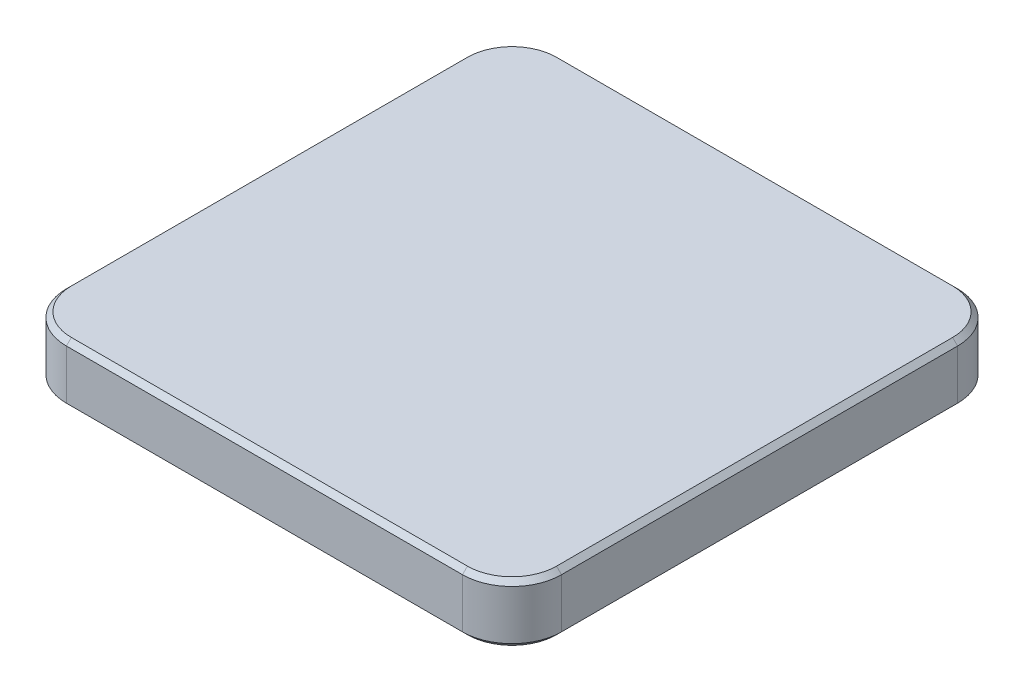
ISO-10303-21;
HEADER;
FILE_DESCRIPTION(('STEP AP214'),'2;1');
FILE_NAME('part.step','',(''),(''),'','','');
FILE_SCHEMA(('AUTOMOTIVE_DESIGN { 1 0 10303 214 1 1 1 1 }'));
ENDSEC;
DATA;
#1=APPLICATION_CONTEXT('core data for automotive mechanical design processes');
#2=APPLICATION_PROTOCOL_DEFINITION('international standard','automotive_design',2000,#1);
#3=PRODUCT_CONTEXT('',#1,'mechanical');
#4=PRODUCT('Part','Part','',(#3));
#5=PRODUCT_RELATED_PRODUCT_CATEGORY('part','',(#4));
#6=PRODUCT_DEFINITION_FORMATION('','',#4);
#7=PRODUCT_DEFINITION_CONTEXT('part definition',#1,'design');
#8=PRODUCT_DEFINITION('design','',#6,#7);
#9=PRODUCT_DEFINITION_SHAPE('','',#8);
#10=(LENGTH_UNIT() NAMED_UNIT(*) SI_UNIT(.MILLI.,.METRE.));
#11=(NAMED_UNIT(*) PLANE_ANGLE_UNIT() SI_UNIT($,.RADIAN.));
#12=(NAMED_UNIT(*) SI_UNIT($,.STERADIAN.) SOLID_ANGLE_UNIT());
#13=UNCERTAINTY_MEASURE_WITH_UNIT(LENGTH_MEASURE(1.E-05),#10,'distance_accuracy_value','');
#14=(GEOMETRIC_REPRESENTATION_CONTEXT(3) GLOBAL_UNCERTAINTY_ASSIGNED_CONTEXT((#13)) GLOBAL_UNIT_ASSIGNED_CONTEXT((#10,
#11,#12)) REPRESENTATION_CONTEXT('',''));
#15=CARTESIAN_POINT('',(0.,0.,0.));
#16=DIRECTION('',(0.,0.,1.));
#17=DIRECTION('',(1.,0.,0.));
#18=AXIS2_PLACEMENT_3D('',#15,#16,#17);
#19=CARTESIAN_POINT('',(50.,12.,50.));
#20=DIRECTION('',(-1.,0.,0.));
#21=DIRECTION('',(0.,0.,1.));
#22=AXIS2_PLACEMENT_3D('',#19,#20,#21);
#23=PLANE('',#22);
#24=DIRECTION('',(0.,-1.,0.));
#25=VECTOR('',#24,1.);
#26=CARTESIAN_POINT('',(50.,12.,40.));
#27=LINE('',#26,#25);
#28=CARTESIAN_POINT('',(50.,11.,40.));
#29=VERTEX_POINT('',#28);
#30=CARTESIAN_POINT('',(50.,1.,40.));
#31=VERTEX_POINT('',#30);
#32=EDGE_CURVE('E338',#29,#31,#27,.T.);
#33=ORIENTED_EDGE('',*,*,#32,.T.);
#34=DIRECTION('',(0.,0.,-1.));
#35=VECTOR('',#34,1.);
#36=CARTESIAN_POINT('',(50.,1.,-40.));
#37=LINE('',#36,#35);
#38=CARTESIAN_POINT('',(50.,1.,-40.));
#39=VERTEX_POINT('',#38);
#40=EDGE_CURVE('E11',#31,#39,#37,.T.);
#41=ORIENTED_EDGE('',*,*,#40,.T.);
#42=DIRECTION('',(0.,-1.,0.));
#43=VECTOR('',#42,1.);
#44=CARTESIAN_POINT('',(50.,12.,-40.));
#45=LINE('',#44,#43);
#46=CARTESIAN_POINT('',(50.,11.,-40.));
#47=VERTEX_POINT('',#46);
#48=EDGE_CURVE('E295',#39,#47,#45,.F.);
#49=ORIENTED_EDGE('',*,*,#48,.T.);
#50=DIRECTION('',(0.,0.,1.));
#51=VECTOR('',#50,1.);
#52=CARTESIAN_POINT('',(50.,11.,50.));
#53=LINE('',#52,#51);
#54=EDGE_CURVE('E272',#47,#29,#53,.T.);
#55=ORIENTED_EDGE('',*,*,#54,.T.);
#56=EDGE_LOOP('',(#33,#41,#49,#55));
#57=FACE_BOUND('',#56,.T.);
#58=ADVANCED_FACE('F38',(#57),#23,.F.);
#59=CARTESIAN_POINT('',(-50.,12.,-50.));
#60=DIRECTION('',(0.,0.,1.));
#61=DIRECTION('',(1.,0.,0.));
#62=AXIS2_PLACEMENT_3D('',#59,#60,#61);
#63=PLANE('',#62);
#64=DIRECTION('',(0.,-1.,0.));
#65=VECTOR('',#64,1.);
#66=CARTESIAN_POINT('',(40.,12.,-50.));
#67=LINE('',#66,#65);
#68=CARTESIAN_POINT('',(40.,11.,-50.));
#69=VERTEX_POINT('',#68);
#70=CARTESIAN_POINT('',(40.,1.,-50.));
#71=VERTEX_POINT('',#70);
#72=EDGE_CURVE('E334',#69,#71,#67,.T.);
#73=ORIENTED_EDGE('',*,*,#72,.T.);
#74=DIRECTION('',(-1.,0.,0.));
#75=VECTOR('',#74,1.);
#76=CARTESIAN_POINT('',(-40.,1.,-50.));
#77=LINE('',#76,#75);
#78=CARTESIAN_POINT('',(-40.,1.,-50.));
#79=VERTEX_POINT('',#78);
#80=EDGE_CURVE('E217',#71,#79,#77,.T.);
#81=ORIENTED_EDGE('',*,*,#80,.T.);
#82=DIRECTION('',(0.,-1.,0.));
#83=VECTOR('',#82,1.);
#84=CARTESIAN_POINT('',(-40.,12.,-50.));
#85=LINE('',#84,#83);
#86=CARTESIAN_POINT('',(-40.,11.,-50.));
#87=VERTEX_POINT('',#86);
#88=EDGE_CURVE('E315',#79,#87,#85,.F.);
#89=ORIENTED_EDGE('',*,*,#88,.T.);
#90=DIRECTION('',(1.,0.,0.));
#91=VECTOR('',#90,1.);
#92=CARTESIAN_POINT('',(-50.,11.,-50.));
#93=LINE('',#92,#91);
#94=EDGE_CURVE('E309',#87,#69,#93,.T.);
#95=ORIENTED_EDGE('',*,*,#94,.T.);
#96=EDGE_LOOP('',(#73,#81,#89,#95));
#97=FACE_BOUND('',#96,.T.);
#98=ADVANCED_FACE('F353',(#97),#63,.F.);
#99=CARTESIAN_POINT('',(-50.,12.,50.));
#100=DIRECTION('',(1.,0.,0.));
#101=DIRECTION('',(0.,0.,-1.));
#102=AXIS2_PLACEMENT_3D('',#99,#100,#101);
#103=PLANE('',#102);
#104=DIRECTION('',(0.,-1.,0.));
#105=VECTOR('',#104,1.);
#106=CARTESIAN_POINT('',(-50.,12.,-40.));
#107=LINE('',#106,#105);
#108=CARTESIAN_POINT('',(-50.,11.,-40.));
#109=VERTEX_POINT('',#108);
#110=CARTESIAN_POINT('',(-50.,1.,-40.));
#111=VERTEX_POINT('',#110);
#112=EDGE_CURVE('E317',#109,#111,#107,.T.);
#113=ORIENTED_EDGE('',*,*,#112,.T.);
#114=DIRECTION('',(0.,0.,1.));
#115=VECTOR('',#114,1.);
#116=CARTESIAN_POINT('',(-50.,1.,40.));
#117=LINE('',#116,#115);
#118=CARTESIAN_POINT('',(-50.,1.,40.));
#119=VERTEX_POINT('',#118);
#120=EDGE_CURVE('E190',#111,#119,#117,.T.);
#121=ORIENTED_EDGE('',*,*,#120,.T.);
#122=DIRECTION('',(0.,-1.,0.));
#123=VECTOR('',#122,1.);
#124=CARTESIAN_POINT('',(-50.,12.,40.));
#125=LINE('',#124,#123);
#126=CARTESIAN_POINT('',(-50.,11.,40.));
#127=VERTEX_POINT('',#126);
#128=EDGE_CURVE('E183',#119,#127,#125,.F.);
#129=ORIENTED_EDGE('',*,*,#128,.T.);
#130=DIRECTION('',(0.,0.,-1.));
#131=VECTOR('',#130,1.);
#132=CARTESIAN_POINT('',(-50.,11.,50.));
#133=LINE('',#132,#131);
#134=EDGE_CURVE('E267',#127,#109,#133,.T.);
#135=ORIENTED_EDGE('',*,*,#134,.T.);
#136=EDGE_LOOP('',(#113,#121,#129,#135));
#137=FACE_BOUND('',#136,.T.);
#138=ADVANCED_FACE('F358',(#137),#103,.F.);
#139=CARTESIAN_POINT('',(-50.,12.,50.));
#140=DIRECTION('',(0.,0.,-1.));
#141=DIRECTION('',(-1.,0.,0.));
#142=AXIS2_PLACEMENT_3D('',#139,#140,#141);
#143=PLANE('',#142);
#144=DIRECTION('',(0.,-1.,0.));
#145=VECTOR('',#144,1.);
#146=CARTESIAN_POINT('',(-40.,12.,50.));
#147=LINE('',#146,#145);
#148=CARTESIAN_POINT('',(-40.,11.,50.));
#149=VERTEX_POINT('',#148);
#150=CARTESIAN_POINT('',(-40.,1.,50.));
#151=VERTEX_POINT('',#150);
#152=EDGE_CURVE('E176',#149,#151,#147,.T.);
#153=ORIENTED_EDGE('',*,*,#152,.T.);
#154=DIRECTION('',(1.,0.,0.));
#155=VECTOR('',#154,1.);
#156=CARTESIAN_POINT('',(40.,1.,50.));
#157=LINE('',#156,#155);
#158=CARTESIAN_POINT('',(40.,1.,50.));
#159=VERTEX_POINT('',#158);
#160=EDGE_CURVE('E215',#151,#159,#157,.T.);
#161=ORIENTED_EDGE('',*,*,#160,.T.);
#162=DIRECTION('',(0.,-1.,0.));
#163=VECTOR('',#162,1.);
#164=CARTESIAN_POINT('',(40.,12.,50.));
#165=LINE('',#164,#163);
#166=CARTESIAN_POINT('',(40.,11.,50.));
#167=VERTEX_POINT('',#166);
#168=EDGE_CURVE('E289',#159,#167,#165,.F.);
#169=ORIENTED_EDGE('',*,*,#168,.T.);
#170=DIRECTION('',(-1.,0.,0.));
#171=VECTOR('',#170,1.);
#172=CARTESIAN_POINT('',(-50.,11.,50.));
#173=LINE('',#172,#171);
#174=EDGE_CURVE('E194',#167,#149,#173,.T.);
#175=ORIENTED_EDGE('',*,*,#174,.T.);
#176=EDGE_LOOP('',(#153,#161,#169,#175));
#177=FACE_BOUND('',#176,.T.);
#178=ADVANCED_FACE('F287',(#177),#143,.F.);
#179=CARTESIAN_POINT('',(0.,12.,0.));
#180=DIRECTION('',(0.,-1.,0.));
#181=DIRECTION('',(0.,0.,-1.));
#182=AXIS2_PLACEMENT_3D('',#179,#180,#181);
#183=PLANE('',#182);
#184=CARTESIAN_POINT('',(40.,12.,-40.));
#185=DIRECTION('',(0.,-1.,0.));
#186=DIRECTION('',(0.,0.,-1.));
#187=AXIS2_PLACEMENT_3D('',#184,#185,#186);
#188=CIRCLE('',#187,8.99999999999998);
#189=CARTESIAN_POINT('',(49.,12.,-40.));
#190=VERTEX_POINT('',#189);
#191=CARTESIAN_POINT('',(40.,12.,-49.));
#192=VERTEX_POINT('',#191);
#193=EDGE_CURVE('E302',#190,#192,#188,.F.);
#194=ORIENTED_EDGE('',*,*,#193,.T.);
#195=DIRECTION('',(-1.,0.,0.));
#196=VECTOR('',#195,1.);
#197=CARTESIAN_POINT('',(0.,12.,-49.));
#198=LINE('',#197,#196);
#199=CARTESIAN_POINT('',(-40.,12.,-49.));
#200=VERTEX_POINT('',#199);
#201=EDGE_CURVE('E306',#192,#200,#198,.T.);
#202=ORIENTED_EDGE('',*,*,#201,.T.);
#203=CARTESIAN_POINT('',(-40.,12.,-40.));
#204=DIRECTION('',(0.,-1.,0.));
#205=DIRECTION('',(0.,0.,-1.));
#206=AXIS2_PLACEMENT_3D('',#203,#204,#205);
#207=CIRCLE('',#206,8.99999999999998);
#208=CARTESIAN_POINT('',(-49.,12.,-40.));
#209=VERTEX_POINT('',#208);
#210=EDGE_CURVE('E304',#200,#209,#207,.F.);
#211=ORIENTED_EDGE('',*,*,#210,.T.);
#212=DIRECTION('',(0.,0.,1.));
#213=VECTOR('',#212,1.);
#214=CARTESIAN_POINT('',(-49.,12.,0.));
#215=LINE('',#214,#213);
#216=CARTESIAN_POINT('',(-49.,12.,40.));
#217=VERTEX_POINT('',#216);
#218=EDGE_CURVE('E159',#209,#217,#215,.T.);
#219=ORIENTED_EDGE('',*,*,#218,.T.);
#220=CARTESIAN_POINT('',(-40.,12.,40.));
#221=DIRECTION('',(0.,-1.,0.));
#222=DIRECTION('',(0.,0.,-1.));
#223=AXIS2_PLACEMENT_3D('',#220,#221,#222);
#224=CIRCLE('',#223,8.99999999999998);
#225=CARTESIAN_POINT('',(-40.,12.,49.));
#226=VERTEX_POINT('',#225);
#227=EDGE_CURVE('E153',#217,#226,#224,.F.);
#228=ORIENTED_EDGE('',*,*,#227,.T.);
#229=DIRECTION('',(1.,0.,0.));
#230=VECTOR('',#229,1.);
#231=CARTESIAN_POINT('',(0.,12.,49.));
#232=LINE('',#231,#230);
#233=CARTESIAN_POINT('',(40.,12.,49.));
#234=VERTEX_POINT('',#233);
#235=EDGE_CURVE('E156',#226,#234,#232,.T.);
#236=ORIENTED_EDGE('',*,*,#235,.T.);
#237=CARTESIAN_POINT('',(40.,12.,40.));
#238=DIRECTION('',(0.,-1.,0.));
#239=DIRECTION('',(0.,0.,-1.));
#240=AXIS2_PLACEMENT_3D('',#237,#238,#239);
#241=CIRCLE('',#240,8.99999999999998);
#242=CARTESIAN_POINT('',(49.,12.,40.));
#243=VERTEX_POINT('',#242);
#244=EDGE_CURVE('E165',#234,#243,#241,.F.);
#245=ORIENTED_EDGE('',*,*,#244,.T.);
#246=DIRECTION('',(0.,0.,-1.));
#247=VECTOR('',#246,1.);
#248=CARTESIAN_POINT('',(49.,12.,0.));
#249=LINE('',#248,#247);
#250=EDGE_CURVE('E164',#243,#190,#249,.T.);
#251=ORIENTED_EDGE('',*,*,#250,.T.);
#252=EDGE_LOOP('',(#194,#202,#211,#219,#228,#236,#245,#251));
#253=FACE_BOUND('',#252,.T.);
#254=ADVANCED_FACE('F155',(#253),#183,.F.);
#255=CARTESIAN_POINT('',(0.,0.,0.));
#256=DIRECTION('',(0.,-1.,0.));
#257=DIRECTION('',(0.,0.,-1.));
#258=AXIS2_PLACEMENT_3D('',#255,#256,#257);
#259=PLANE('',#258);
#260=CARTESIAN_POINT('',(-40.,0.,40.));
#261=DIRECTION('',(0.,-1.,0.));
#262=DIRECTION('',(0.,0.,-1.));
#263=AXIS2_PLACEMENT_3D('',#260,#261,#262);
#264=CIRCLE('',#263,8.99999999999999);
#265=CARTESIAN_POINT('',(-40.,0.,49.));
#266=VERTEX_POINT('',#265);
#267=CARTESIAN_POINT('',(-49.,0.,40.));
#268=VERTEX_POINT('',#267);
#269=EDGE_CURVE('E206',#266,#268,#264,.T.);
#270=ORIENTED_EDGE('',*,*,#269,.T.);
#271=DIRECTION('',(0.,0.,-1.));
#272=VECTOR('',#271,1.);
#273=CARTESIAN_POINT('',(-49.,0.,-40.));
#274=LINE('',#273,#272);
#275=CARTESIAN_POINT('',(-49.,0.,-40.));
#276=VERTEX_POINT('',#275);
#277=EDGE_CURVE('E208',#268,#276,#274,.T.);
#278=ORIENTED_EDGE('',*,*,#277,.T.);
#279=CARTESIAN_POINT('',(-40.,0.,-40.));
#280=DIRECTION('',(0.,-1.,0.));
#281=DIRECTION('',(0.,0.,-1.));
#282=AXIS2_PLACEMENT_3D('',#279,#280,#281);
#283=CIRCLE('',#282,8.99999999999999);
#284=CARTESIAN_POINT('',(-40.,0.,-49.));
#285=VERTEX_POINT('',#284);
#286=EDGE_CURVE('E204',#276,#285,#283,.T.);
#287=ORIENTED_EDGE('',*,*,#286,.T.);
#288=DIRECTION('',(1.,0.,0.));
#289=VECTOR('',#288,1.);
#290=CARTESIAN_POINT('',(40.,0.,-49.));
#291=LINE('',#290,#289);
#292=CARTESIAN_POINT('',(40.,0.,-49.));
#293=VERTEX_POINT('',#292);
#294=EDGE_CURVE('E200',#285,#293,#291,.T.);
#295=ORIENTED_EDGE('',*,*,#294,.T.);
#296=CARTESIAN_POINT('',(40.,0.,-40.));
#297=DIRECTION('',(0.,-1.,0.));
#298=DIRECTION('',(0.,0.,-1.));
#299=AXIS2_PLACEMENT_3D('',#296,#297,#298);
#300=CIRCLE('',#299,8.99999999999999);
#301=CARTESIAN_POINT('',(49.,0.,-40.));
#302=VERTEX_POINT('',#301);
#303=EDGE_CURVE('E196',#293,#302,#300,.T.);
#304=ORIENTED_EDGE('',*,*,#303,.T.);
#305=DIRECTION('',(0.,0.,1.));
#306=VECTOR('',#305,1.);
#307=CARTESIAN_POINT('',(49.,0.,40.));
#308=LINE('',#307,#306);
#309=CARTESIAN_POINT('',(49.,0.,40.));
#310=VERTEX_POINT('',#309);
#311=EDGE_CURVE('E193',#302,#310,#308,.T.);
#312=ORIENTED_EDGE('',*,*,#311,.T.);
#313=CARTESIAN_POINT('',(40.,0.,40.));
#314=DIRECTION('',(0.,-1.,0.));
#315=DIRECTION('',(0.,0.,-1.));
#316=AXIS2_PLACEMENT_3D('',#313,#314,#315);
#317=CIRCLE('',#316,8.99999999999999);
#318=CARTESIAN_POINT('',(40.,0.,49.));
#319=VERTEX_POINT('',#318);
#320=EDGE_CURVE('E198',#310,#319,#317,.T.);
#321=ORIENTED_EDGE('',*,*,#320,.T.);
#322=DIRECTION('',(-1.,0.,0.));
#323=VECTOR('',#322,1.);
#324=CARTESIAN_POINT('',(-40.,0.,49.));
#325=LINE('',#324,#323);
#326=EDGE_CURVE('E202',#319,#266,#325,.T.);
#327=ORIENTED_EDGE('',*,*,#326,.T.);
#328=EDGE_LOOP('',(#270,#278,#287,#295,#304,#312,#321,#327));
#329=FACE_BOUND('',#328,.T.);
#330=ADVANCED_FACE('F364',(#329),#259,.T.);
#331=CARTESIAN_POINT('',(-40.,12.,-40.));
#332=DIRECTION('',(0.,-1.,0.));
#333=DIRECTION('',(0.,0.,-1.));
#334=AXIS2_PLACEMENT_3D('',#331,#332,#333);
#335=CYLINDRICAL_SURFACE('',#334,10.);
#336=ORIENTED_EDGE('',*,*,#88,.F.);
#337=CARTESIAN_POINT('',(-40.,1.,-40.));
#338=DIRECTION('',(0.,-1.,0.));
#339=DIRECTION('',(0.,0.,-1.));
#340=AXIS2_PLACEMENT_3D('',#337,#338,#339);
#341=CIRCLE('',#340,10.);
#342=EDGE_CURVE('E213',#79,#111,#341,.F.);
#343=ORIENTED_EDGE('',*,*,#342,.T.);
#344=ORIENTED_EDGE('',*,*,#112,.F.);
#345=CARTESIAN_POINT('',(-40.,11.,-40.));
#346=DIRECTION('',(0.,-1.,0.));
#347=DIRECTION('',(0.,0.,-1.));
#348=AXIS2_PLACEMENT_3D('',#345,#346,#347);
#349=CIRCLE('',#348,10.);
#350=EDGE_CURVE('E277',#109,#87,#349,.T.);
#351=ORIENTED_EDGE('',*,*,#350,.T.);
#352=EDGE_LOOP('',(#336,#343,#344,#351));
#353=FACE_BOUND('',#352,.T.);
#354=ADVANCED_FACE('F314',(#353),#335,.T.);
#355=CARTESIAN_POINT('',(40.,12.,-40.));
#356=DIRECTION('',(0.,-1.,0.));
#357=DIRECTION('',(0.,0.,-1.));
#358=AXIS2_PLACEMENT_3D('',#355,#356,#357);
#359=CYLINDRICAL_SURFACE('',#358,10.);
#360=ORIENTED_EDGE('',*,*,#48,.F.);
#361=CARTESIAN_POINT('',(40.,1.,-40.));
#362=DIRECTION('',(0.,-1.,0.));
#363=DIRECTION('',(0.,0.,-1.));
#364=AXIS2_PLACEMENT_3D('',#361,#362,#363);
#365=CIRCLE('',#364,10.);
#366=EDGE_CURVE('E48',#39,#71,#365,.F.);
#367=ORIENTED_EDGE('',*,*,#366,.T.);
#368=ORIENTED_EDGE('',*,*,#72,.F.);
#369=CARTESIAN_POINT('',(40.,11.,-40.));
#370=DIRECTION('',(0.,-1.,0.));
#371=DIRECTION('',(0.,0.,-1.));
#372=AXIS2_PLACEMENT_3D('',#369,#370,#371);
#373=CIRCLE('',#372,10.);
#374=EDGE_CURVE('E273',#69,#47,#373,.T.);
#375=ORIENTED_EDGE('',*,*,#374,.T.);
#376=EDGE_LOOP('',(#360,#367,#368,#375));
#377=FACE_BOUND('',#376,.T.);
#378=ADVANCED_FACE('F333',(#377),#359,.T.);
#379=CARTESIAN_POINT('',(-40.,12.,40.));
#380=DIRECTION('',(0.,-1.,0.));
#381=DIRECTION('',(0.,0.,-1.));
#382=AXIS2_PLACEMENT_3D('',#379,#380,#381);
#383=CYLINDRICAL_SURFACE('',#382,10.);
#384=ORIENTED_EDGE('',*,*,#128,.F.);
#385=CARTESIAN_POINT('',(-40.,1.,40.));
#386=DIRECTION('',(0.,-1.,0.));
#387=DIRECTION('',(0.,0.,-1.));
#388=AXIS2_PLACEMENT_3D('',#385,#386,#387);
#389=CIRCLE('',#388,10.);
#390=EDGE_CURVE('E211',#119,#151,#389,.F.);
#391=ORIENTED_EDGE('',*,*,#390,.T.);
#392=ORIENTED_EDGE('',*,*,#152,.F.);
#393=CARTESIAN_POINT('',(-40.,11.,40.));
#394=DIRECTION('',(0.,-1.,0.));
#395=DIRECTION('',(0.,0.,-1.));
#396=AXIS2_PLACEMENT_3D('',#393,#394,#395);
#397=CIRCLE('',#396,10.);
#398=EDGE_CURVE('E180',#149,#127,#397,.T.);
#399=ORIENTED_EDGE('',*,*,#398,.T.);
#400=EDGE_LOOP('',(#384,#391,#392,#399));
#401=FACE_BOUND('',#400,.T.);
#402=ADVANCED_FACE('F292',(#401),#383,.T.);
#403=CARTESIAN_POINT('',(40.,12.,40.));
#404=DIRECTION('',(0.,-1.,0.));
#405=DIRECTION('',(0.,0.,-1.));
#406=AXIS2_PLACEMENT_3D('',#403,#404,#405);
#407=CYLINDRICAL_SURFACE('',#406,10.);
#408=ORIENTED_EDGE('',*,*,#168,.F.);
#409=CARTESIAN_POINT('',(40.,1.,40.));
#410=DIRECTION('',(0.,-1.,0.));
#411=DIRECTION('',(0.,0.,-1.));
#412=AXIS2_PLACEMENT_3D('',#409,#410,#411);
#413=CIRCLE('',#412,10.);
#414=EDGE_CURVE('E62',#159,#31,#413,.F.);
#415=ORIENTED_EDGE('',*,*,#414,.T.);
#416=ORIENTED_EDGE('',*,*,#32,.F.);
#417=CARTESIAN_POINT('',(40.,11.,40.));
#418=DIRECTION('',(0.,-1.,0.));
#419=DIRECTION('',(0.,0.,-1.));
#420=AXIS2_PLACEMENT_3D('',#417,#418,#419);
#421=CIRCLE('',#420,10.);
#422=EDGE_CURVE('E281',#29,#167,#421,.T.);
#423=ORIENTED_EDGE('',*,*,#422,.T.);
#424=EDGE_LOOP('',(#408,#415,#416,#423));
#425=FACE_BOUND('',#424,.T.);
#426=ADVANCED_FACE('F339',(#425),#407,.T.);
#427=CARTESIAN_POINT('',(0.,12.,49.));
#428=DIRECTION('',(0.,-0.707106781186547,-0.707106781186547));
#429=DIRECTION('',(1.,0.,0.));
#430=AXIS2_PLACEMENT_3D('',#427,#428,#429);
#431=PLANE('',#430);
#432=DIRECTION('',(0.,0.707106781186547,-0.707106781186547));
#433=VECTOR('',#432,1.);
#434=CARTESIAN_POINT('',(-40.,11.,50.));
#435=LINE('',#434,#433);
#436=EDGE_CURVE('E171',#149,#226,#435,.T.);
#437=ORIENTED_EDGE('',*,*,#436,.F.);
#438=ORIENTED_EDGE('',*,*,#174,.F.);
#439=DIRECTION('',(0.,-0.707106781186547,0.707106781186547));
#440=VECTOR('',#439,1.);
#441=CARTESIAN_POINT('',(40.,12.,49.));
#442=LINE('',#441,#440);
#443=EDGE_CURVE('E174',#234,#167,#442,.T.);
#444=ORIENTED_EDGE('',*,*,#443,.F.);
#445=ORIENTED_EDGE('',*,*,#235,.F.);
#446=EDGE_LOOP('',(#437,#438,#444,#445));
#447=FACE_BOUND('',#446,.T.);
#448=ADVANCED_FACE('F169',(#447),#431,.F.);
#449=CARTESIAN_POINT('',(40.,12.,40.));
#450=DIRECTION('',(0.,-1.,0.));
#451=DIRECTION('',(0.,0.,-1.));
#452=AXIS2_PLACEMENT_3D('',#449,#450,#451);
#453=CONICAL_SURFACE('',#452,8.99999999999998,0.785398163397449);
#454=ORIENTED_EDGE('',*,*,#443,.T.);
#455=ORIENTED_EDGE('',*,*,#422,.F.);
#456=DIRECTION('',(0.707106781186547,-0.707106781186547,0.));
#457=VECTOR('',#456,1.);
#458=CARTESIAN_POINT('',(49.,12.,40.));
#459=LINE('',#458,#457);
#460=EDGE_CURVE('E181',#243,#29,#459,.T.);
#461=ORIENTED_EDGE('',*,*,#460,.F.);
#462=ORIENTED_EDGE('',*,*,#244,.F.);
#463=EDGE_LOOP('',(#454,#455,#461,#462));
#464=FACE_BOUND('',#463,.T.);
#465=ADVANCED_FACE('F342',(#464),#453,.T.);
#466=CARTESIAN_POINT('',(-40.,12.,40.));
#467=DIRECTION('',(0.,-1.,0.));
#468=DIRECTION('',(0.,0.,-1.));
#469=AXIS2_PLACEMENT_3D('',#466,#467,#468);
#470=CONICAL_SURFACE('',#469,8.99999999999998,0.785398163397449);
#471=ORIENTED_EDGE('',*,*,#436,.T.);
#472=ORIENTED_EDGE('',*,*,#227,.F.);
#473=DIRECTION('',(0.707106781186547,0.707106781186547,0.));
#474=VECTOR('',#473,1.);
#475=CARTESIAN_POINT('',(-50.,11.,40.));
#476=LINE('',#475,#474);
#477=EDGE_CURVE('E186',#127,#217,#476,.T.);
#478=ORIENTED_EDGE('',*,*,#477,.F.);
#479=ORIENTED_EDGE('',*,*,#398,.F.);
#480=EDGE_LOOP('',(#471,#472,#478,#479));
#481=FACE_BOUND('',#480,.T.);
#482=ADVANCED_FACE('F178',(#481),#470,.T.);
#483=CARTESIAN_POINT('',(49.,12.,0.));
#484=DIRECTION('',(-0.707106781186547,-0.707106781186547,0.));
#485=DIRECTION('',(0.,0.,-1.));
#486=AXIS2_PLACEMENT_3D('',#483,#484,#485);
#487=PLANE('',#486);
#488=ORIENTED_EDGE('',*,*,#460,.T.);
#489=ORIENTED_EDGE('',*,*,#54,.F.);
#490=DIRECTION('',(0.707106781186547,-0.707106781186547,0.));
#491=VECTOR('',#490,1.);
#492=CARTESIAN_POINT('',(49.,12.,-40.));
#493=LINE('',#492,#491);
#494=EDGE_CURVE('E261',#190,#47,#493,.T.);
#495=ORIENTED_EDGE('',*,*,#494,.F.);
#496=ORIENTED_EDGE('',*,*,#250,.F.);
#497=EDGE_LOOP('',(#488,#489,#495,#496));
#498=FACE_BOUND('',#497,.T.);
#499=ADVANCED_FACE('F336',(#498),#487,.F.);
#500=CARTESIAN_POINT('',(-49.,12.,0.));
#501=DIRECTION('',(0.707106781186547,-0.707106781186547,0.));
#502=DIRECTION('',(0.,0.,1.));
#503=AXIS2_PLACEMENT_3D('',#500,#501,#502);
#504=PLANE('',#503);
#505=ORIENTED_EDGE('',*,*,#477,.T.);
#506=ORIENTED_EDGE('',*,*,#218,.F.);
#507=DIRECTION('',(0.707106781186547,0.707106781186547,0.));
#508=VECTOR('',#507,1.);
#509=CARTESIAN_POINT('',(-50.,11.,-40.));
#510=LINE('',#509,#508);
#511=EDGE_CURVE('E254',#109,#209,#510,.T.);
#512=ORIENTED_EDGE('',*,*,#511,.F.);
#513=ORIENTED_EDGE('',*,*,#134,.F.);
#514=EDGE_LOOP('',(#505,#506,#512,#513));
#515=FACE_BOUND('',#514,.T.);
#516=ADVANCED_FACE('F265',(#515),#504,.F.);
#517=CARTESIAN_POINT('',(40.,12.,-40.));
#518=DIRECTION('',(0.,-1.,0.));
#519=DIRECTION('',(0.,0.,-1.));
#520=AXIS2_PLACEMENT_3D('',#517,#518,#519);
#521=CONICAL_SURFACE('',#520,8.99999999999998,0.785398163397449);
#522=ORIENTED_EDGE('',*,*,#494,.T.);
#523=ORIENTED_EDGE('',*,*,#374,.F.);
#524=DIRECTION('',(0.,-0.707106781186547,-0.707106781186547));
#525=VECTOR('',#524,1.);
#526=CARTESIAN_POINT('',(40.,12.,-49.));
#527=LINE('',#526,#525);
#528=EDGE_CURVE('E247',#192,#69,#527,.T.);
#529=ORIENTED_EDGE('',*,*,#528,.F.);
#530=ORIENTED_EDGE('',*,*,#193,.F.);
#531=EDGE_LOOP('',(#522,#523,#529,#530));
#532=FACE_BOUND('',#531,.T.);
#533=ADVANCED_FACE('F330',(#532),#521,.T.);
#534=CARTESIAN_POINT('',(-40.,12.,-40.));
#535=DIRECTION('',(0.,-1.,0.));
#536=DIRECTION('',(0.,0.,-1.));
#537=AXIS2_PLACEMENT_3D('',#534,#535,#536);
#538=CONICAL_SURFACE('',#537,8.99999999999998,0.785398163397449);
#539=ORIENTED_EDGE('',*,*,#511,.T.);
#540=ORIENTED_EDGE('',*,*,#210,.F.);
#541=DIRECTION('',(0.,0.707106781186547,0.707106781186547));
#542=VECTOR('',#541,1.);
#543=CARTESIAN_POINT('',(-40.,11.,-50.));
#544=LINE('',#543,#542);
#545=EDGE_CURVE('E242',#87,#200,#544,.T.);
#546=ORIENTED_EDGE('',*,*,#545,.F.);
#547=ORIENTED_EDGE('',*,*,#350,.F.);
#548=EDGE_LOOP('',(#539,#540,#546,#547));
#549=FACE_BOUND('',#548,.T.);
#550=ADVANCED_FACE('F325',(#549),#538,.T.);
#551=CARTESIAN_POINT('',(0.,12.,-49.));
#552=DIRECTION('',(0.,-0.707106781186547,0.707106781186547));
#553=DIRECTION('',(-1.,0.,0.));
#554=AXIS2_PLACEMENT_3D('',#551,#552,#553);
#555=PLANE('',#554);
#556=ORIENTED_EDGE('',*,*,#528,.T.);
#557=ORIENTED_EDGE('',*,*,#94,.F.);
#558=ORIENTED_EDGE('',*,*,#545,.T.);
#559=ORIENTED_EDGE('',*,*,#201,.F.);
#560=EDGE_LOOP('',(#556,#557,#558,#559));
#561=FACE_BOUND('',#560,.T.);
#562=ADVANCED_FACE('F319',(#561),#555,.F.);
#563=CARTESIAN_POINT('',(50.,1.,50.));
#564=DIRECTION('',(0.707106781186547,-0.707106781186547,0.));
#565=DIRECTION('',(0.,0.,1.));
#566=AXIS2_PLACEMENT_3D('',#563,#564,#565);
#567=PLANE('',#566);
#568=DIRECTION('',(0.707106781186547,0.707106781186547,0.));
#569=VECTOR('',#568,1.);
#570=CARTESIAN_POINT('',(49.,0.,40.));
#571=LINE('',#570,#569);
#572=EDGE_CURVE('E236',#310,#31,#571,.T.);
#573=ORIENTED_EDGE('',*,*,#572,.F.);
#574=ORIENTED_EDGE('',*,*,#311,.F.);
#575=DIRECTION('',(-0.707106781186547,-0.707106781186547,0.));
#576=VECTOR('',#575,1.);
#577=CARTESIAN_POINT('',(50.,1.,-40.));
#578=LINE('',#577,#576);
#579=EDGE_CURVE('E43',#39,#302,#578,.T.);
#580=ORIENTED_EDGE('',*,*,#579,.F.);
#581=ORIENTED_EDGE('',*,*,#40,.F.);
#582=EDGE_LOOP('',(#573,#574,#580,#581));
#583=FACE_BOUND('',#582,.T.);
#584=ADVANCED_FACE('F41',(#583),#567,.T.);
#585=CARTESIAN_POINT('',(40.,0.,-40.));
#586=DIRECTION('',(0.,1.,0.));
#587=DIRECTION('',(0.,0.,1.));
#588=AXIS2_PLACEMENT_3D('',#585,#586,#587);
#589=CONICAL_SURFACE('',#588,8.99999999999999,0.785398163397449);
#590=ORIENTED_EDGE('',*,*,#579,.T.);
#591=ORIENTED_EDGE('',*,*,#303,.F.);
#592=DIRECTION('',(0.,-0.707106781186547,0.707106781186547));
#593=VECTOR('',#592,1.);
#594=CARTESIAN_POINT('',(40.,1.,-50.));
#595=LINE('',#594,#593);
#596=EDGE_CURVE('E234',#71,#293,#595,.T.);
#597=ORIENTED_EDGE('',*,*,#596,.F.);
#598=ORIENTED_EDGE('',*,*,#366,.F.);
#599=EDGE_LOOP('',(#590,#591,#597,#598));
#600=FACE_BOUND('',#599,.T.);
#601=ADVANCED_FACE('F445',(#600),#589,.T.);
#602=CARTESIAN_POINT('',(40.,0.,40.));
#603=DIRECTION('',(0.,1.,0.));
#604=DIRECTION('',(0.,0.,1.));
#605=AXIS2_PLACEMENT_3D('',#602,#603,#604);
#606=CONICAL_SURFACE('',#605,8.99999999999999,0.785398163397449);
#607=ORIENTED_EDGE('',*,*,#572,.T.);
#608=ORIENTED_EDGE('',*,*,#414,.F.);
#609=DIRECTION('',(0.,0.707106781186547,0.707106781186547));
#610=VECTOR('',#609,1.);
#611=CARTESIAN_POINT('',(40.,0.,49.));
#612=LINE('',#611,#610);
#613=EDGE_CURVE('E231',#319,#159,#612,.T.);
#614=ORIENTED_EDGE('',*,*,#613,.F.);
#615=ORIENTED_EDGE('',*,*,#320,.F.);
#616=EDGE_LOOP('',(#607,#608,#614,#615));
#617=FACE_BOUND('',#616,.T.);
#618=ADVANCED_FACE('F439',(#617),#606,.T.);
#619=CARTESIAN_POINT('',(-50.,1.,-50.));
#620=DIRECTION('',(0.,-0.707106781186547,-0.707106781186547));
#621=DIRECTION('',(1.,0.,0.));
#622=AXIS2_PLACEMENT_3D('',#619,#620,#621);
#623=PLANE('',#622);
#624=ORIENTED_EDGE('',*,*,#596,.T.);
#625=ORIENTED_EDGE('',*,*,#294,.F.);
#626=DIRECTION('',(0.,-0.707106781186547,0.707106781186547));
#627=VECTOR('',#626,1.);
#628=CARTESIAN_POINT('',(-40.,1.,-50.));
#629=LINE('',#628,#627);
#630=EDGE_CURVE('E228',#79,#285,#629,.T.);
#631=ORIENTED_EDGE('',*,*,#630,.F.);
#632=ORIENTED_EDGE('',*,*,#80,.F.);
#633=EDGE_LOOP('',(#624,#625,#631,#632));
#634=FACE_BOUND('',#633,.T.);
#635=ADVANCED_FACE('F432',(#634),#623,.T.);
#636=CARTESIAN_POINT('',(-50.,1.,50.));
#637=DIRECTION('',(0.,-0.707106781186547,0.707106781186547));
#638=DIRECTION('',(-1.,0.,0.));
#639=AXIS2_PLACEMENT_3D('',#636,#637,#638);
#640=PLANE('',#639);
#641=ORIENTED_EDGE('',*,*,#613,.T.);
#642=ORIENTED_EDGE('',*,*,#160,.F.);
#643=DIRECTION('',(0.,0.707106781186547,0.707106781186547));
#644=VECTOR('',#643,1.);
#645=CARTESIAN_POINT('',(-40.,0.,49.));
#646=LINE('',#645,#644);
#647=EDGE_CURVE('E225',#266,#151,#646,.T.);
#648=ORIENTED_EDGE('',*,*,#647,.F.);
#649=ORIENTED_EDGE('',*,*,#326,.F.);
#650=EDGE_LOOP('',(#641,#642,#648,#649));
#651=FACE_BOUND('',#650,.T.);
#652=ADVANCED_FACE('F425',(#651),#640,.T.);
#653=CARTESIAN_POINT('',(-40.,0.,-40.));
#654=DIRECTION('',(0.,1.,0.));
#655=DIRECTION('',(0.,0.,1.));
#656=AXIS2_PLACEMENT_3D('',#653,#654,#655);
#657=CONICAL_SURFACE('',#656,8.99999999999999,0.785398163397449);
#658=ORIENTED_EDGE('',*,*,#630,.T.);
#659=ORIENTED_EDGE('',*,*,#286,.F.);
#660=DIRECTION('',(0.707106781186547,-0.707106781186547,0.));
#661=VECTOR('',#660,1.);
#662=CARTESIAN_POINT('',(-50.,1.,-40.));
#663=LINE('',#662,#661);
#664=EDGE_CURVE('E223',#111,#276,#663,.T.);
#665=ORIENTED_EDGE('',*,*,#664,.F.);
#666=ORIENTED_EDGE('',*,*,#342,.F.);
#667=EDGE_LOOP('',(#658,#659,#665,#666));
#668=FACE_BOUND('',#667,.T.);
#669=ADVANCED_FACE('F418',(#668),#657,.T.);
#670=CARTESIAN_POINT('',(-40.,0.,40.));
#671=DIRECTION('',(0.,1.,0.));
#672=DIRECTION('',(0.,0.,1.));
#673=AXIS2_PLACEMENT_3D('',#670,#671,#672);
#674=CONICAL_SURFACE('',#673,8.99999999999999,0.785398163397449);
#675=ORIENTED_EDGE('',*,*,#647,.T.);
#676=ORIENTED_EDGE('',*,*,#390,.F.);
#677=DIRECTION('',(-0.707106781186547,0.707106781186547,0.));
#678=VECTOR('',#677,1.);
#679=CARTESIAN_POINT('',(-49.,0.,40.));
#680=LINE('',#679,#678);
#681=EDGE_CURVE('E221',#268,#119,#680,.T.);
#682=ORIENTED_EDGE('',*,*,#681,.F.);
#683=ORIENTED_EDGE('',*,*,#269,.F.);
#684=EDGE_LOOP('',(#675,#676,#682,#683));
#685=FACE_BOUND('',#684,.T.);
#686=ADVANCED_FACE('F411',(#685),#674,.T.);
#687=CARTESIAN_POINT('',(-50.,1.,50.));
#688=DIRECTION('',(-0.707106781186547,-0.707106781186547,0.));
#689=DIRECTION('',(0.,0.,-1.));
#690=AXIS2_PLACEMENT_3D('',#687,#688,#689);
#691=PLANE('',#690);
#692=ORIENTED_EDGE('',*,*,#664,.T.);
#693=ORIENTED_EDGE('',*,*,#277,.F.);
#694=ORIENTED_EDGE('',*,*,#681,.T.);
#695=ORIENTED_EDGE('',*,*,#120,.F.);
#696=EDGE_LOOP('',(#692,#693,#694,#695));
#697=FACE_BOUND('',#696,.T.);
#698=ADVANCED_FACE('F405',(#697),#691,.T.);
#699=CLOSED_SHELL('',(#58,#98,#138,#178,#254,#330,#354,#378,#402,#426,#448,#465,#482,#499,#516,
#533,#550,#562,#584,#601,#618,#635,#652,#669,#686,#698));
#700=MANIFOLD_SOLID_BREP('B2',#699);
#701=ADVANCED_BREP_SHAPE_REPRESENTATION('',(#18,#700),#14);
#702=SHAPE_DEFINITION_REPRESENTATION(#9,#701);
ENDSEC;
END-ISO-10303-21;
